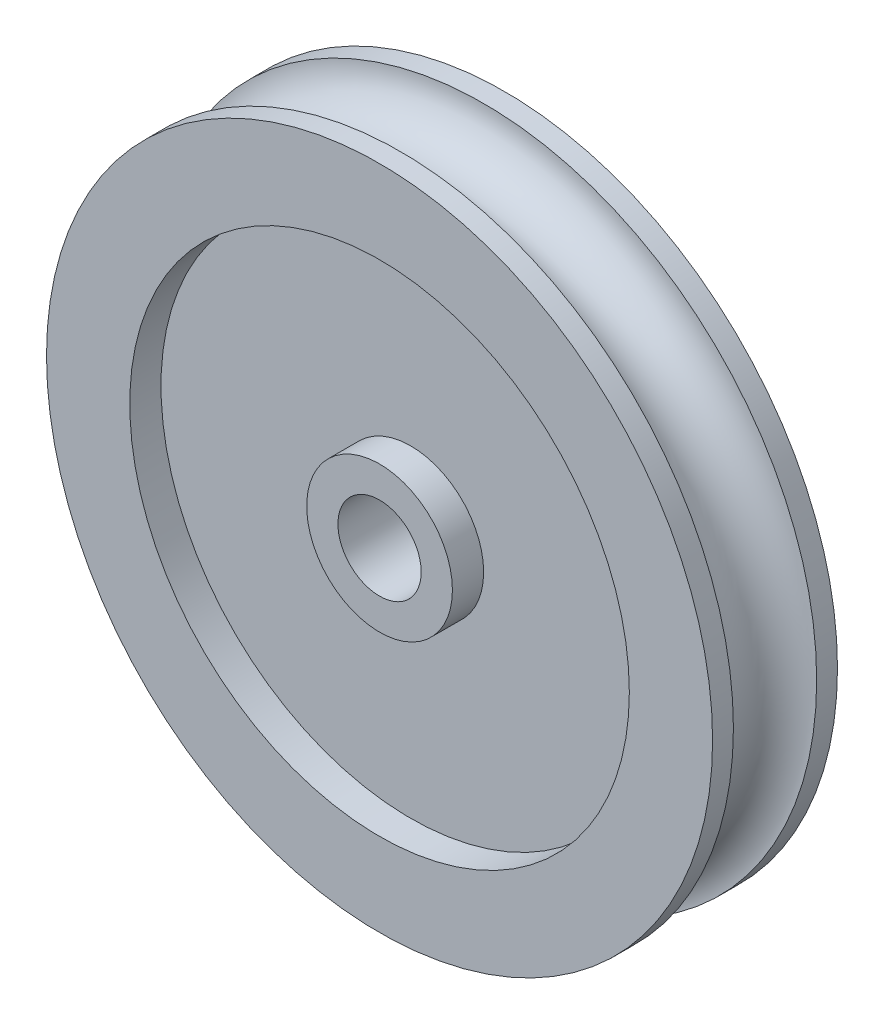
ISO-10303-21;
HEADER;
FILE_DESCRIPTION(('STEP AP214'),'2;1');
FILE_NAME('part.step','',(''),(''),'','','');
FILE_SCHEMA(('AUTOMOTIVE_DESIGN { 1 0 10303 214 1 1 1 1 }'));
ENDSEC;
DATA;
#1=APPLICATION_CONTEXT('core data for automotive mechanical design processes');
#2=APPLICATION_PROTOCOL_DEFINITION('international standard','automotive_design',2000,#1);
#3=PRODUCT_CONTEXT('',#1,'mechanical');
#4=PRODUCT('Part','Part','',(#3));
#5=PRODUCT_RELATED_PRODUCT_CATEGORY('part','',(#4));
#6=PRODUCT_DEFINITION_FORMATION('','',#4);
#7=PRODUCT_DEFINITION_CONTEXT('part definition',#1,'design');
#8=PRODUCT_DEFINITION('design','',#6,#7);
#9=PRODUCT_DEFINITION_SHAPE('','',#8);
#10=(LENGTH_UNIT() NAMED_UNIT(*) SI_UNIT(.MILLI.,.METRE.));
#11=(NAMED_UNIT(*) PLANE_ANGLE_UNIT() SI_UNIT($,.RADIAN.));
#12=(NAMED_UNIT(*) SI_UNIT($,.STERADIAN.) SOLID_ANGLE_UNIT());
#13=UNCERTAINTY_MEASURE_WITH_UNIT(LENGTH_MEASURE(1.E-05),#10,'distance_accuracy_value','');
#14=(GEOMETRIC_REPRESENTATION_CONTEXT(3) GLOBAL_UNCERTAINTY_ASSIGNED_CONTEXT((#13)) GLOBAL_UNIT_ASSIGNED_CONTEXT((#10,
#11,#12)) REPRESENTATION_CONTEXT('',''));
#15=CARTESIAN_POINT('',(0.,0.,0.));
#16=DIRECTION('',(0.,0.,1.));
#17=DIRECTION('',(1.,0.,0.));
#18=AXIS2_PLACEMENT_3D('',#15,#16,#17);
#19=CARTESIAN_POINT('',(0.,0.,17.8641433736685));
#20=DIRECTION('',(0.,0.,1.));
#21=DIRECTION('',(1.,0.,0.));
#22=AXIS2_PLACEMENT_3D('',#19,#20,#21);
#23=CYLINDRICAL_SURFACE('',#22,11.1125);
#24=CARTESIAN_POINT('',(0.,0.,-4.7625));
#25=DIRECTION('',(0.,0.,1.));
#26=DIRECTION('',(1.,0.,0.));
#27=AXIS2_PLACEMENT_3D('',#24,#25,#26);
#28=CIRCLE('',#27,11.1125);
#29=CARTESIAN_POINT('',(11.1125,0.,-4.7625));
#30=VERTEX_POINT('',#29);
#31=EDGE_CURVE('E10',#30,#30,#28,.T.);
#32=ORIENTED_EDGE('',*,*,#31,.F.);
#33=EDGE_LOOP('',(#32));
#34=FACE_BOUND('',#33,.T.);
#35=CARTESIAN_POINT('',(0.,0.,-9.52500000000001));
#36=DIRECTION('',(0.,0.,1.));
#37=DIRECTION('',(1.,0.,0.));
#38=AXIS2_PLACEMENT_3D('',#35,#36,#37);
#39=CIRCLE('',#38,11.1125);
#40=CARTESIAN_POINT('',(11.1125,0.,-9.52500000000001));
#41=VERTEX_POINT('',#40);
#42=EDGE_CURVE('E100',#41,#41,#39,.T.);
#43=ORIENTED_EDGE('',*,*,#42,.T.);
#44=EDGE_LOOP('',(#43));
#45=FACE_BOUND('',#44,.T.);
#46=ADVANCED_FACE('F41',(#34,#45),#23,.T.);
#47=CARTESIAN_POINT('',(0.,11.1125,-4.7625));
#48=DIRECTION('',(0.,0.,1.));
#49=DIRECTION('',(1.,0.,0.));
#50=AXIS2_PLACEMENT_3D('',#47,#48,#49);
#51=PLANE('',#50);
#52=CARTESIAN_POINT('',(0.,0.,-4.7625));
#53=DIRECTION('',(0.,0.,1.));
#54=DIRECTION('',(1.,0.,0.));
#55=AXIS2_PLACEMENT_3D('',#52,#53,#54);
#56=CIRCLE('',#55,38.1);
#57=CARTESIAN_POINT('',(38.1,0.,-4.7625));
#58=VERTEX_POINT('',#57);
#59=EDGE_CURVE('E48',#58,#58,#56,.T.);
#60=ORIENTED_EDGE('',*,*,#59,.F.);
#61=EDGE_LOOP('',(#60));
#62=FACE_BOUND('',#61,.T.);
#63=ORIENTED_EDGE('',*,*,#31,.T.);
#64=EDGE_LOOP('',(#63));
#65=FACE_BOUND('',#64,.T.);
#66=ADVANCED_FACE('F174',(#62,#65),#51,.F.);
#67=CARTESIAN_POINT('',(0.,0.,17.8641433736685));
#68=DIRECTION('',(0.,0.,1.));
#69=DIRECTION('',(1.,0.,0.));
#70=AXIS2_PLACEMENT_3D('',#67,#68,#69);
#71=CYLINDRICAL_SURFACE('',#70,38.1);
#72=CARTESIAN_POINT('',(0.,0.,-9.525));
#73=DIRECTION('',(0.,0.,1.));
#74=DIRECTION('',(1.,0.,0.));
#75=AXIS2_PLACEMENT_3D('',#72,#73,#74);
#76=CIRCLE('',#75,38.1);
#77=CARTESIAN_POINT('',(38.1,0.,-9.525));
#78=VERTEX_POINT('',#77);
#79=EDGE_CURVE('E53',#78,#78,#76,.T.);
#80=ORIENTED_EDGE('',*,*,#79,.F.);
#81=EDGE_LOOP('',(#80));
#82=FACE_BOUND('',#81,.T.);
#83=ORIENTED_EDGE('',*,*,#59,.T.);
#84=EDGE_LOOP('',(#83));
#85=FACE_BOUND('',#84,.T.);
#86=ADVANCED_FACE('F169',(#82,#85),#71,.F.);
#87=CARTESIAN_POINT('',(0.,38.1,-9.525));
#88=DIRECTION('',(0.,0.,1.));
#89=DIRECTION('',(1.,0.,0.));
#90=AXIS2_PLACEMENT_3D('',#87,#88,#89);
#91=PLANE('',#90);
#92=CARTESIAN_POINT('',(0.,0.,-9.525));
#93=DIRECTION('',(0.,0.,1.));
#94=DIRECTION('',(1.,0.,0.));
#95=AXIS2_PLACEMENT_3D('',#92,#93,#94);
#96=CIRCLE('',#95,50.8);
#97=CARTESIAN_POINT('',(50.8,0.,-9.525));
#98=VERTEX_POINT('',#97);
#99=EDGE_CURVE('E58',#98,#98,#96,.T.);
#100=ORIENTED_EDGE('',*,*,#99,.F.);
#101=EDGE_LOOP('',(#100));
#102=FACE_BOUND('',#101,.T.);
#103=ORIENTED_EDGE('',*,*,#79,.T.);
#104=EDGE_LOOP('',(#103));
#105=FACE_BOUND('',#104,.T.);
#106=ADVANCED_FACE('F163',(#102,#105),#91,.F.);
#107=CARTESIAN_POINT('',(0.,0.,17.8641433736685));
#108=DIRECTION('',(0.,0.,1.));
#109=DIRECTION('',(1.,0.,0.));
#110=AXIS2_PLACEMENT_3D('',#107,#108,#109);
#111=CYLINDRICAL_SURFACE('',#110,50.8);
#112=CARTESIAN_POINT('',(0.,0.,-6.35));
#113=DIRECTION('',(0.,0.,1.));
#114=DIRECTION('',(1.,0.,0.));
#115=AXIS2_PLACEMENT_3D('',#112,#113,#114);
#116=CIRCLE('',#115,50.8);
#117=CARTESIAN_POINT('',(50.8,0.,-6.35));
#118=VERTEX_POINT('',#117);
#119=EDGE_CURVE('E64',#118,#118,#116,.T.);
#120=ORIENTED_EDGE('',*,*,#119,.F.);
#121=EDGE_LOOP('',(#120));
#122=FACE_BOUND('',#121,.T.);
#123=ORIENTED_EDGE('',*,*,#99,.T.);
#124=EDGE_LOOP('',(#123));
#125=FACE_BOUND('',#124,.T.);
#126=ADVANCED_FACE('F157',(#122,#125),#111,.T.);
#127=CARTESIAN_POINT('',(0.,0.,0.));
#128=DIRECTION('',(0.,0.,1.));
#129=DIRECTION('',(1.,0.,0.));
#130=AXIS2_PLACEMENT_3D('',#127,#128,#129);
#131=TOROIDAL_SURFACE('',#130,50.8,6.35);
#132=CARTESIAN_POINT('',(0.,0.,6.35));
#133=DIRECTION('',(0.,0.,1.));
#134=DIRECTION('',(1.,0.,0.));
#135=AXIS2_PLACEMENT_3D('',#132,#133,#134);
#136=CIRCLE('',#135,50.8);
#137=CARTESIAN_POINT('',(50.8,0.,6.35));
#138=VERTEX_POINT('',#137);
#139=EDGE_CURVE('E68',#138,#138,#136,.T.);
#140=ORIENTED_EDGE('',*,*,#139,.F.);
#141=EDGE_LOOP('',(#140));
#142=FACE_BOUND('',#141,.T.);
#143=ORIENTED_EDGE('',*,*,#119,.T.);
#144=EDGE_LOOP('',(#143));
#145=FACE_BOUND('',#144,.T.);
#146=ADVANCED_FACE('F151',(#142,#145),#131,.F.);
#147=CARTESIAN_POINT('',(0.,0.,17.8641433736685));
#148=DIRECTION('',(0.,0.,1.));
#149=DIRECTION('',(1.,0.,0.));
#150=AXIS2_PLACEMENT_3D('',#147,#148,#149);
#151=CYLINDRICAL_SURFACE('',#150,50.8);
#152=CARTESIAN_POINT('',(0.,0.,9.525));
#153=DIRECTION('',(0.,0.,1.));
#154=DIRECTION('',(1.,0.,0.));
#155=AXIS2_PLACEMENT_3D('',#152,#153,#154);
#156=CIRCLE('',#155,50.8);
#157=CARTESIAN_POINT('',(50.8,0.,9.525));
#158=VERTEX_POINT('',#157);
#159=EDGE_CURVE('E72',#158,#158,#156,.T.);
#160=ORIENTED_EDGE('',*,*,#159,.F.);
#161=EDGE_LOOP('',(#160));
#162=FACE_BOUND('',#161,.T.);
#163=ORIENTED_EDGE('',*,*,#139,.T.);
#164=EDGE_LOOP('',(#163));
#165=FACE_BOUND('',#164,.T.);
#166=ADVANCED_FACE('F145',(#162,#165),#151,.T.);
#167=CARTESIAN_POINT('',(0.,38.1,9.525));
#168=DIRECTION('',(0.,0.,-1.));
#169=DIRECTION('',(-1.,0.,0.));
#170=AXIS2_PLACEMENT_3D('',#167,#168,#169);
#171=PLANE('',#170);
#172=CARTESIAN_POINT('',(0.,0.,9.525));
#173=DIRECTION('',(0.,0.,1.));
#174=DIRECTION('',(1.,0.,0.));
#175=AXIS2_PLACEMENT_3D('',#172,#173,#174);
#176=CIRCLE('',#175,38.1);
#177=CARTESIAN_POINT('',(38.1,0.,9.525));
#178=VERTEX_POINT('',#177);
#179=EDGE_CURVE('E76',#178,#178,#176,.T.);
#180=ORIENTED_EDGE('',*,*,#179,.F.);
#181=EDGE_LOOP('',(#180));
#182=FACE_BOUND('',#181,.T.);
#183=ORIENTED_EDGE('',*,*,#159,.T.);
#184=EDGE_LOOP('',(#183));
#185=FACE_BOUND('',#184,.T.);
#186=ADVANCED_FACE('F139',(#182,#185),#171,.F.);
#187=CARTESIAN_POINT('',(0.,0.,17.8641433736685));
#188=DIRECTION('',(0.,0.,1.));
#189=DIRECTION('',(1.,0.,0.));
#190=AXIS2_PLACEMENT_3D('',#187,#188,#189);
#191=CYLINDRICAL_SURFACE('',#190,38.1);
#192=CARTESIAN_POINT('',(0.,0.,4.7625));
#193=DIRECTION('',(0.,0.,1.));
#194=DIRECTION('',(1.,0.,0.));
#195=AXIS2_PLACEMENT_3D('',#192,#193,#194);
#196=CIRCLE('',#195,38.1);
#197=CARTESIAN_POINT('',(38.1,0.,4.7625));
#198=VERTEX_POINT('',#197);
#199=EDGE_CURVE('E80',#198,#198,#196,.T.);
#200=ORIENTED_EDGE('',*,*,#199,.F.);
#201=EDGE_LOOP('',(#200));
#202=FACE_BOUND('',#201,.T.);
#203=ORIENTED_EDGE('',*,*,#179,.T.);
#204=EDGE_LOOP('',(#203));
#205=FACE_BOUND('',#204,.T.);
#206=ADVANCED_FACE('F133',(#202,#205),#191,.F.);
#207=CARTESIAN_POINT('',(0.,11.1125,4.7625));
#208=DIRECTION('',(0.,0.,-1.));
#209=DIRECTION('',(-1.,0.,0.));
#210=AXIS2_PLACEMENT_3D('',#207,#208,#209);
#211=PLANE('',#210);
#212=CARTESIAN_POINT('',(0.,0.,4.76249999999999));
#213=DIRECTION('',(0.,0.,1.));
#214=DIRECTION('',(1.,0.,0.));
#215=AXIS2_PLACEMENT_3D('',#212,#213,#214);
#216=CIRCLE('',#215,11.1125);
#217=CARTESIAN_POINT('',(11.1125,0.,4.76249999999999));
#218=VERTEX_POINT('',#217);
#219=EDGE_CURVE('E84',#218,#218,#216,.T.);
#220=ORIENTED_EDGE('',*,*,#219,.F.);
#221=EDGE_LOOP('',(#220));
#222=FACE_BOUND('',#221,.T.);
#223=ORIENTED_EDGE('',*,*,#199,.T.);
#224=EDGE_LOOP('',(#223));
#225=FACE_BOUND('',#224,.T.);
#226=ADVANCED_FACE('F127',(#222,#225),#211,.F.);
#227=CARTESIAN_POINT('',(0.,0.,17.8641433736685));
#228=DIRECTION('',(0.,0.,1.));
#229=DIRECTION('',(1.,0.,0.));
#230=AXIS2_PLACEMENT_3D('',#227,#228,#229);
#231=CYLINDRICAL_SURFACE('',#230,11.1125);
#232=CARTESIAN_POINT('',(0.,0.,9.525));
#233=DIRECTION('',(0.,0.,1.));
#234=DIRECTION('',(1.,0.,0.));
#235=AXIS2_PLACEMENT_3D('',#232,#233,#234);
#236=CIRCLE('',#235,11.1125);
#237=CARTESIAN_POINT('',(11.1125,0.,9.525));
#238=VERTEX_POINT('',#237);
#239=EDGE_CURVE('E88',#238,#238,#236,.T.);
#240=ORIENTED_EDGE('',*,*,#239,.F.);
#241=EDGE_LOOP('',(#240));
#242=FACE_BOUND('',#241,.T.);
#243=ORIENTED_EDGE('',*,*,#219,.T.);
#244=EDGE_LOOP('',(#243));
#245=FACE_BOUND('',#244,.T.);
#246=ADVANCED_FACE('F121',(#242,#245),#231,.T.);
#247=CARTESIAN_POINT('',(0.,6.35,9.525));
#248=DIRECTION('',(0.,0.,-1.));
#249=DIRECTION('',(-1.,0.,0.));
#250=AXIS2_PLACEMENT_3D('',#247,#248,#249);
#251=PLANE('',#250);
#252=CARTESIAN_POINT('',(0.,0.,9.525));
#253=DIRECTION('',(0.,0.,1.));
#254=DIRECTION('',(1.,0.,0.));
#255=AXIS2_PLACEMENT_3D('',#252,#253,#254);
#256=CIRCLE('',#255,6.35);
#257=CARTESIAN_POINT('',(6.35,0.,9.525));
#258=VERTEX_POINT('',#257);
#259=EDGE_CURVE('E92',#258,#258,#256,.T.);
#260=ORIENTED_EDGE('',*,*,#259,.F.);
#261=EDGE_LOOP('',(#260));
#262=FACE_BOUND('',#261,.T.);
#263=ORIENTED_EDGE('',*,*,#239,.T.);
#264=EDGE_LOOP('',(#263));
#265=FACE_BOUND('',#264,.T.);
#266=ADVANCED_FACE('F115',(#262,#265),#251,.F.);
#267=CARTESIAN_POINT('',(0.,0.,17.8641433736685));
#268=DIRECTION('',(0.,0.,1.));
#269=DIRECTION('',(1.,0.,0.));
#270=AXIS2_PLACEMENT_3D('',#267,#268,#269);
#271=CYLINDRICAL_SURFACE('',#270,6.35);
#272=CARTESIAN_POINT('',(0.,0.,-9.52500000000001));
#273=DIRECTION('',(0.,0.,1.));
#274=DIRECTION('',(1.,0.,0.));
#275=AXIS2_PLACEMENT_3D('',#272,#273,#274);
#276=CIRCLE('',#275,6.35);
#277=CARTESIAN_POINT('',(6.35,0.,-9.52500000000001));
#278=VERTEX_POINT('',#277);
#279=EDGE_CURVE('E96',#278,#278,#276,.T.);
#280=ORIENTED_EDGE('',*,*,#279,.F.);
#281=EDGE_LOOP('',(#280));
#282=FACE_BOUND('',#281,.T.);
#283=ORIENTED_EDGE('',*,*,#259,.T.);
#284=EDGE_LOOP('',(#283));
#285=FACE_BOUND('',#284,.T.);
#286=ADVANCED_FACE('F109',(#282,#285),#271,.F.);
#287=CARTESIAN_POINT('',(0.,6.35,-9.52500000000001));
#288=DIRECTION('',(0.,0.,1.));
#289=DIRECTION('',(1.,0.,0.));
#290=AXIS2_PLACEMENT_3D('',#287,#288,#289);
#291=PLANE('',#290);
#292=ORIENTED_EDGE('',*,*,#42,.F.);
#293=EDGE_LOOP('',(#292));
#294=FACE_BOUND('',#293,.T.);
#295=ORIENTED_EDGE('',*,*,#279,.T.);
#296=EDGE_LOOP('',(#295));
#297=FACE_BOUND('',#296,.T.);
#298=ADVANCED_FACE('F106',(#294,#297),#291,.F.);
#299=CLOSED_SHELL('',(#46,#66,#86,#106,#126,#146,#166,#186,#206,#226,#246,#266,#286,#298));
#300=MANIFOLD_SOLID_BREP('B2',#299);
#301=ADVANCED_BREP_SHAPE_REPRESENTATION('',(#18,#300),#14);
#302=SHAPE_DEFINITION_REPRESENTATION(#9,#301);
ENDSEC;
END-ISO-10303-21;
